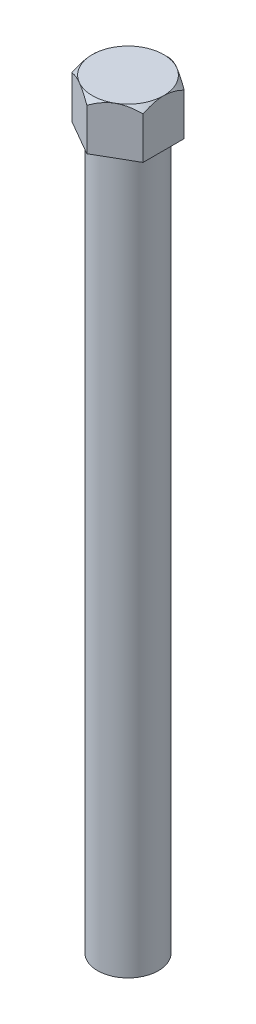
ISO-10303-21;
HEADER;
FILE_DESCRIPTION(('STEP AP214'),'2;1');
FILE_NAME('part.step','',(''),(''),'','','');
FILE_SCHEMA(('AUTOMOTIVE_DESIGN { 1 0 10303 214 1 1 1 1 }'));
ENDSEC;
DATA;
#1=APPLICATION_CONTEXT('core data for automotive mechanical design processes');
#2=APPLICATION_PROTOCOL_DEFINITION('international standard','automotive_design',2000,#1);
#3=PRODUCT_CONTEXT('',#1,'mechanical');
#4=PRODUCT('Part','Part','',(#3));
#5=PRODUCT_RELATED_PRODUCT_CATEGORY('part','',(#4));
#6=PRODUCT_DEFINITION_FORMATION('','',#4);
#7=PRODUCT_DEFINITION_CONTEXT('part definition',#1,'design');
#8=PRODUCT_DEFINITION('design','',#6,#7);
#9=PRODUCT_DEFINITION_SHAPE('','',#8);
#10=(LENGTH_UNIT() NAMED_UNIT(*) SI_UNIT(.MILLI.,.METRE.));
#11=(NAMED_UNIT(*) PLANE_ANGLE_UNIT() SI_UNIT($,.RADIAN.));
#12=(NAMED_UNIT(*) SI_UNIT($,.STERADIAN.) SOLID_ANGLE_UNIT());
#13=UNCERTAINTY_MEASURE_WITH_UNIT(LENGTH_MEASURE(1.E-05),#10,'distance_accuracy_value','');
#14=(GEOMETRIC_REPRESENTATION_CONTEXT(3) GLOBAL_UNCERTAINTY_ASSIGNED_CONTEXT((#13)) GLOBAL_UNIT_ASSIGNED_CONTEXT((#10,
#11,#12)) REPRESENTATION_CONTEXT('',''));
#15=CARTESIAN_POINT('',(0.,0.,0.));
#16=DIRECTION('',(0.,0.,1.));
#17=DIRECTION('',(1.,0.,0.));
#18=AXIS2_PLACEMENT_3D('',#15,#16,#17);
#19=CARTESIAN_POINT('',(0.15,0.2,0.0866025403784438));
#20=DIRECTION('',(-1.,0.,0.));
#21=DIRECTION('',(0.,0.,1.));
#22=AXIS2_PLACEMENT_3D('',#19,#20,#21);
#23=PLANE('',#22);
#24=CARTESIAN_POINT('',(0.15,0.0475902294985284,0.262586498690913));
#25=CARTESIAN_POINT('',(0.15,0.0543267282291559,0.254826375964097));
#26=CARTESIAN_POINT('',(0.15,0.0610238543481202,0.247031178307719));
#27=CARTESIAN_POINT('',(0.15,0.0743131220412113,0.231345588074376));
#28=CARTESIAN_POINT('',(0.15,0.0809052125666027,0.223455152298885));
#29=CARTESIAN_POINT('',(0.15,0.100768108493642,0.199257368061424));
#30=CARTESIAN_POINT('',(0.15,0.11381994836992,0.182770324489989));
#31=CARTESIAN_POINT('',(0.15,0.13891072504273,0.148967316027861));
#32=CARTESIAN_POINT('',(0.15,0.150948238113777,0.13165023782954));
#33=CARTESIAN_POINT('',(0.15,0.167227978592448,0.104665718305432));
#34=CARTESIAN_POINT('',(0.15,0.172343792373168,0.0955360588615133));
#35=CARTESIAN_POINT('',(0.15,0.181664431110572,0.0768307253928077));
#36=CARTESIAN_POINT('',(0.15,0.185870920669696,0.0672559060106033));
#37=CARTESIAN_POINT('',(0.15,0.192978036944956,0.0473652391411249));
#38=CARTESIAN_POINT('',(0.15,0.195847761671669,0.0370376939426317));
#39=CARTESIAN_POINT('',(0.15,0.199489177750611,0.016062265711483));
#40=CARTESIAN_POINT('',(0.15,0.200275178683666,0.00541707791099994));
#41=CARTESIAN_POINT('',(0.15,0.199545010815921,-0.015805559072031));
#42=CARTESIAN_POINT('',(0.15,0.198024815260256,-0.0263828573137506));
#43=CARTESIAN_POINT('',(0.15,0.193097371978144,-0.0471394448417892));
#44=CARTESIAN_POINT('',(0.15,0.189675480583831,-0.0573149809526654));
#45=CARTESIAN_POINT('',(0.15,0.180692373013377,-0.0792923162711168));
#46=CARTESIAN_POINT('',(0.15,0.174827193237606,-0.0909641323370518));
#47=CARTESIAN_POINT('',(0.15,0.162007185387538,-0.113704536639999));
#48=CARTESIAN_POINT('',(0.15,0.155049617254444,-0.124771511003992));
#49=CARTESIAN_POINT('',(0.15,0.133165926569079,-0.157430248891432));
#50=CARTESIAN_POINT('',(0.15,0.117284564930081,-0.178371211639012));
#51=CARTESIAN_POINT('',(0.15,0.0922013732823992,-0.209758792369407));
#52=CARTESIAN_POINT('',(0.15,0.0833643286592083,-0.220516380024448));
#53=CARTESIAN_POINT('',(0.15,0.0655713989105796,-0.241730110309001));
#54=CARTESIAN_POINT('',(0.15,0.0566179307426882,-0.252188275318011));
#55=CARTESIAN_POINT('',(0.15,0.0475902294985459,-0.262586498690927));
#56=B_SPLINE_CURVE_WITH_KNOTS('',3,(#24,#25,#26,#27,#28,#29,#30,#31,#32,#33,#34,#35,#36,#37,#38,
#39,#40,#41,#42,#43,#44,#45,#46,#47,#48,#49,#50,#51,#52,#53,#54,#55),.UNSPECIFIED.,.F.,.F.,(4,2,
2,2,2,2,2,2,2,2,2,2,2,2,2,4),(0.,0.0308295106196295,0.0616735738810823,0.124747488513428,
0.187908509085988,0.219272585467537,0.250578751447974,0.282576530373673,0.314353994406209,
0.346187007659217,0.378268611399949,0.417354566871308,0.456540176553576,0.535274804547161,
0.57704263562936,0.61834564938272),.UNSPECIFIED.);
#57=CARTESIAN_POINT('',(0.149999999999989,0.176794919243123,0.0866025403784503));
#58=VERTEX_POINT('',#57);
#59=CARTESIAN_POINT('',(0.15,0.2,0.));
#60=VERTEX_POINT('',#59);
#61=EDGE_CURVE('E114',#58,#60,#56,.T.);
#62=ORIENTED_EDGE('',*,*,#61,.F.);
#63=DIRECTION('',(0.,-1.,0.));
#64=VECTOR('',#63,1.);
#65=CARTESIAN_POINT('',(0.15,0.2,0.0866025403784438));
#66=LINE('',#65,#64);
#67=CARTESIAN_POINT('',(0.15,0.,0.0866025403784438));
#68=VERTEX_POINT('',#67);
#69=EDGE_CURVE('E63',#58,#68,#66,.T.);
#70=ORIENTED_EDGE('',*,*,#69,.T.);
#71=DIRECTION('',(0.,0.,-1.));
#72=VECTOR('',#71,1.);
#73=CARTESIAN_POINT('',(0.15,0.,0.0866025403784438));
#74=LINE('',#73,#72);
#75=CARTESIAN_POINT('',(0.15,0.,-0.0866025403784439));
#76=VERTEX_POINT('',#75);
#77=EDGE_CURVE('E237',#68,#76,#74,.T.);
#78=ORIENTED_EDGE('',*,*,#77,.T.);
#79=DIRECTION('',(0.,-1.,0.));
#80=VECTOR('',#79,1.);
#81=CARTESIAN_POINT('',(0.15,0.2,-0.0866025403784439));
#82=LINE('',#81,#80);
#83=CARTESIAN_POINT('',(0.149999999999989,0.176794919243123,-0.0866025403784504));
#84=VERTEX_POINT('',#83);
#85=EDGE_CURVE('E134',#84,#76,#82,.T.);
#86=ORIENTED_EDGE('',*,*,#85,.F.);
#87=EDGE_CURVE('E122',#60,#84,#56,.T.);
#88=ORIENTED_EDGE('',*,*,#87,.F.);
#89=EDGE_LOOP('',(#62,#70,#78,#86,#88));
#90=FACE_BOUND('',#89,.T.);
#91=ADVANCED_FACE('F40',(#90),#23,.F.);
#92=CARTESIAN_POINT('',(0.15,0.2,-0.0866025403784439));
#93=DIRECTION('',(-0.499999999999999,0.,0.866025403784439));
#94=DIRECTION('',(0.866025403784439,0.,0.5));
#95=AXIS2_PLACEMENT_3D('',#92,#93,#94);
#96=PLANE('',#95);
#97=CARTESIAN_POINT('',(0.1502,0.176679333796188,-0.086487070324606));
#98=CARTESIAN_POINT('',(0.145025219073231,0.179664213238513,-0.0894747314856735));
#99=CARTESIAN_POINT('',(0.139774588038488,0.182476766429922,-0.0925061847269979));
#100=CARTESIAN_POINT('',(0.129067226667655,0.187627561192785,-0.0986880826967589));
#101=CARTESIAN_POINT('',(0.123609467511676,0.189962921862806,-0.101839121414635));
#102=CARTESIAN_POINT('',(0.107145801716877,0.195929217966136,-0.11134442329311));
#103=CARTESIAN_POINT('',(0.0958544415040203,0.198644596260582,-0.11786349315152));
#104=CARTESIAN_POINT('',(0.0763180955426587,0.200287457293129,-0.129142807751294));
#105=CARTESIAN_POINT('',(0.0681268918469172,0.200077123458692,-0.133872001410018));
#106=CARTESIAN_POINT('',(0.0519118635019776,0.19793463068477,-0.143233752389886));
#107=CARTESIAN_POINT('',(0.0438883087297734,0.195999886089794,-0.147866153897476));
#108=CARTESIAN_POINT('',(0.0297680454683194,0.191320688529291,-0.156018491692504));
#109=CARTESIAN_POINT('',(0.0236074535372857,0.188816236813761,-0.159575311102254));
#110=CARTESIAN_POINT('',(0.0115286846033072,0.18317217065888,-0.166548991597766));
#111=CARTESIAN_POINT('',(0.00560979406743726,0.180034617240185,-0.169966264641954));
#112=CARTESIAN_POINT('',(-0.000200000000328769,0.176679333797509,-0.173320550810915));
#113=B_SPLINE_CURVE_WITH_KNOTS('',3,(#97,#98,#99,#100,#101,#102,#103,#104,#105,#106,#107,#108,
#109,#110,#111,#112),.UNSPECIFIED.,.F.,.F.,(4,2,2,2,2,2,2,4),(0.,0.0200322815723706,
0.0401821439649004,0.0797202979159777,0.107933680780694,0.136189439305524,0.158782101417156,
0.181302367981685),.UNSPECIFIED.);
#114=CARTESIAN_POINT('',(0.0749999999999999,0.2,-0.129903810567666));
#115=VERTEX_POINT('',#114);
#116=EDGE_CURVE('E127',#84,#115,#113,.T.);
#117=ORIENTED_EDGE('',*,*,#116,.F.);
#118=ORIENTED_EDGE('',*,*,#85,.T.);
#119=DIRECTION('',(-0.866025403784439,0.,-0.5));
#120=VECTOR('',#119,1.);
#121=CARTESIAN_POINT('',(0.15,0.,-0.0866025403784439));
#122=LINE('',#121,#120);
#123=CARTESIAN_POINT('',(0.,0.,-0.173205080756888));
#124=VERTEX_POINT('',#123);
#125=EDGE_CURVE('E239',#76,#124,#122,.T.);
#126=ORIENTED_EDGE('',*,*,#125,.T.);
#127=DIRECTION('',(0.,-1.,0.));
#128=VECTOR('',#127,1.);
#129=CARTESIAN_POINT('',(0.,0.2,-0.173205080756888));
#130=LINE('',#129,#128);
#131=CARTESIAN_POINT('',(0.,0.176794919243123,-0.173205080756881));
#132=VERTEX_POINT('',#131);
#133=EDGE_CURVE('E204',#132,#124,#130,.T.);
#134=ORIENTED_EDGE('',*,*,#133,.F.);
#135=EDGE_CURVE('E135',#115,#132,#113,.T.);
#136=ORIENTED_EDGE('',*,*,#135,.F.);
#137=EDGE_LOOP('',(#117,#118,#126,#134,#136));
#138=FACE_BOUND('',#137,.T.);
#139=ADVANCED_FACE('F192',(#138),#96,.F.);
#140=CARTESIAN_POINT('',(0.,0.2,-0.173205080756888));
#141=DIRECTION('',(0.5,0.,0.866025403784439));
#142=DIRECTION('',(0.866025403784439,0.,-0.5));
#143=AXIS2_PLACEMENT_3D('',#140,#141,#142);
#144=PLANE('',#143);
#145=CARTESIAN_POINT('',(0.000199999999999994,0.176679333796188,-0.173320550810726));
#146=CARTESIAN_POINT('',(-0.0049747809267692,0.179664213238513,-0.170332889649658));
#147=CARTESIAN_POINT('',(-0.0102254119615123,0.182476766429922,-0.167301436408334));
#148=CARTESIAN_POINT('',(-0.0209327733323452,0.187627561192785,-0.161119538438573));
#149=CARTESIAN_POINT('',(-0.0263905324883241,0.189962921862806,-0.157968499720696));
#150=CARTESIAN_POINT('',(-0.0428541982831226,0.195929217966136,-0.148463197842221));
#151=CARTESIAN_POINT('',(-0.0541455584959796,0.198644596260582,-0.141944127983811));
#152=CARTESIAN_POINT('',(-0.0736819044573412,0.200287457293129,-0.130664813384037));
#153=CARTESIAN_POINT('',(-0.0818731081530827,0.200077123458692,-0.125935619725314));
#154=CARTESIAN_POINT('',(-0.0980881364980222,0.19793463068477,-0.116573868745446));
#155=CARTESIAN_POINT('',(-0.106111691270226,0.195999886089794,-0.111941467237856));
#156=CARTESIAN_POINT('',(-0.12023195453168,0.191320688529291,-0.103789129442827));
#157=CARTESIAN_POINT('',(-0.126392546462714,0.188816236813762,-0.100232310033077));
#158=CARTESIAN_POINT('',(-0.138471315396693,0.18317217065888,-0.0932586295375655));
#159=CARTESIAN_POINT('',(-0.144390205932563,0.180034617240185,-0.0898413564933771));
#160=CARTESIAN_POINT('',(-0.150200000000329,0.176679333797509,-0.0864870703244161));
#161=B_SPLINE_CURVE_WITH_KNOTS('',3,(#145,#146,#147,#148,#149,#150,#151,#152,#153,#154,#155,
#156,#157,#158,#159,#160),.UNSPECIFIED.,.F.,.F.,(4,2,2,2,2,2,2,4),(0.,0.0200322815723706,
0.0401821439649003,0.0797202979159775,0.107933680780694,0.136189439305524,0.158782101417156,
0.181302367981685),.UNSPECIFIED.);
#162=CARTESIAN_POINT('',(-0.075,0.2,-0.129903810567666));
#163=VERTEX_POINT('',#162);
#164=EDGE_CURVE('E186',#132,#163,#161,.T.);
#165=ORIENTED_EDGE('',*,*,#164,.F.);
#166=ORIENTED_EDGE('',*,*,#133,.T.);
#167=DIRECTION('',(-0.866025403784439,0.,0.5));
#168=VECTOR('',#167,1.);
#169=CARTESIAN_POINT('',(0.,0.,-0.173205080756888));
#170=LINE('',#169,#168);
#171=CARTESIAN_POINT('',(-0.15,0.,-0.0866025403784438));
#172=VERTEX_POINT('',#171);
#173=EDGE_CURVE('E222',#124,#172,#170,.T.);
#174=ORIENTED_EDGE('',*,*,#173,.T.);
#175=DIRECTION('',(0.,-1.,0.));
#176=VECTOR('',#175,1.);
#177=CARTESIAN_POINT('',(-0.15,0.2,-0.0866025403784438));
#178=LINE('',#177,#176);
#179=CARTESIAN_POINT('',(-0.15,0.176794919243112,-0.0866025403784438));
#180=VERTEX_POINT('',#179);
#181=EDGE_CURVE('E220',#180,#172,#178,.T.);
#182=ORIENTED_EDGE('',*,*,#181,.F.);
#183=EDGE_CURVE('E180',#163,#180,#161,.T.);
#184=ORIENTED_EDGE('',*,*,#183,.F.);
#185=EDGE_LOOP('',(#165,#166,#174,#182,#184));
#186=FACE_BOUND('',#185,.T.);
#187=ADVANCED_FACE('F188',(#186),#144,.F.);
#188=CARTESIAN_POINT('',(-0.15,0.2,-0.0866025403784438));
#189=DIRECTION('',(1.,0.,0.));
#190=DIRECTION('',(0.,0.,-1.));
#191=AXIS2_PLACEMENT_3D('',#188,#189,#190);
#192=PLANE('',#191);
#193=CARTESIAN_POINT('',(-0.15,0.0475902294985284,-0.262586498690913));
#194=CARTESIAN_POINT('',(-0.15,0.0543267282291559,-0.254826375964097));
#195=CARTESIAN_POINT('',(-0.15,0.0610238543481202,-0.247031178307719));
#196=CARTESIAN_POINT('',(-0.15,0.0743131220412113,-0.231345588074377));
#197=CARTESIAN_POINT('',(-0.15,0.0809052125666027,-0.223455152298885));
#198=CARTESIAN_POINT('',(-0.15,0.100768108493642,-0.199257368061424));
#199=CARTESIAN_POINT('',(-0.15,0.11381994836992,-0.182770324489989));
#200=CARTESIAN_POINT('',(-0.15,0.13891072504273,-0.148967316027861));
#201=CARTESIAN_POINT('',(-0.15,0.150948238113777,-0.13165023782954));
#202=CARTESIAN_POINT('',(-0.15,0.167227978592448,-0.104665718305432));
#203=CARTESIAN_POINT('',(-0.15,0.172343792373168,-0.0955360588615133));
#204=CARTESIAN_POINT('',(-0.15,0.181664431110572,-0.0768307253928077));
#205=CARTESIAN_POINT('',(-0.15,0.185870920669696,-0.0672559060106033));
#206=CARTESIAN_POINT('',(-0.15,0.192978036944956,-0.047365239141125));
#207=CARTESIAN_POINT('',(-0.15,0.195847761671669,-0.0370376939426317));
#208=CARTESIAN_POINT('',(-0.15,0.199489177750611,-0.016062265711483));
#209=CARTESIAN_POINT('',(-0.15,0.200275178683666,-0.00541707791099998));
#210=CARTESIAN_POINT('',(-0.15,0.199545010815921,0.0158055590720309));
#211=CARTESIAN_POINT('',(-0.15,0.198024815260256,0.0263828573137505));
#212=CARTESIAN_POINT('',(-0.15,0.193097371978145,0.0471394448417891));
#213=CARTESIAN_POINT('',(-0.15,0.189675480583831,0.0573149809526653));
#214=CARTESIAN_POINT('',(-0.15,0.180692373013378,0.0792923162711167));
#215=CARTESIAN_POINT('',(-0.15,0.174827193237607,0.0909641323370517));
#216=CARTESIAN_POINT('',(-0.15,0.162007185387538,0.113704536639999));
#217=CARTESIAN_POINT('',(-0.15,0.155049617254444,0.124771511003992));
#218=CARTESIAN_POINT('',(-0.15,0.133165926569079,0.157430248891432));
#219=CARTESIAN_POINT('',(-0.15,0.117284564930082,0.178371211639012));
#220=CARTESIAN_POINT('',(-0.15,0.0922013732823995,0.209758792369407));
#221=CARTESIAN_POINT('',(-0.15,0.0833643286592085,0.220516380024448));
#222=CARTESIAN_POINT('',(-0.15,0.0655713989105797,0.241730110309001));
#223=CARTESIAN_POINT('',(-0.15,0.0566179307426884,0.252188275318011));
#224=CARTESIAN_POINT('',(-0.15,0.047590229498546,0.262586498690927));
#225=B_SPLINE_CURVE_WITH_KNOTS('',3,(#193,#194,#195,#196,#197,#198,#199,#200,#201,#202,#203,
#204,#205,#206,#207,#208,#209,#210,#211,#212,#213,#214,#215,#216,#217,#218,#219,#220,#221,#222,
#223,#224),.UNSPECIFIED.,.F.,.F.,(4,2,2,2,2,2,2,2,2,2,2,2,2,2,2,4),(0.,0.0308295106196294,
0.0616735738810823,0.124747488513428,0.187908509085988,0.219272585467537,0.250578751447974,
0.282576530373673,0.314353994406209,0.346187007659217,0.378268611399949,0.417354566871308,
0.456540176553576,0.535274804547161,0.57704263562936,0.618345649382719),.UNSPECIFIED.);
#226=CARTESIAN_POINT('',(-0.15,0.2,0.));
#227=VERTEX_POINT('',#226);
#228=EDGE_CURVE('E187',#180,#227,#225,.T.);
#229=ORIENTED_EDGE('',*,*,#228,.F.);
#230=ORIENTED_EDGE('',*,*,#181,.T.);
#231=DIRECTION('',(0.,0.,1.));
#232=VECTOR('',#231,1.);
#233=CARTESIAN_POINT('',(-0.15,0.,-0.0866025403784438));
#234=LINE('',#233,#232);
#235=CARTESIAN_POINT('',(-0.15,0.,0.0866025403784439));
#236=VERTEX_POINT('',#235);
#237=EDGE_CURVE('E242',#172,#236,#234,.T.);
#238=ORIENTED_EDGE('',*,*,#237,.T.);
#239=DIRECTION('',(0.,-1.,0.));
#240=VECTOR('',#239,1.);
#241=CARTESIAN_POINT('',(-0.15,0.2,0.0866025403784439));
#242=LINE('',#241,#240);
#243=CARTESIAN_POINT('',(-0.149999999999989,0.176794919243123,0.0866025403784503));
#244=VERTEX_POINT('',#243);
#245=EDGE_CURVE('E226',#244,#236,#242,.T.);
#246=ORIENTED_EDGE('',*,*,#245,.F.);
#247=EDGE_CURVE('E174',#227,#244,#225,.T.);
#248=ORIENTED_EDGE('',*,*,#247,.F.);
#249=EDGE_LOOP('',(#229,#230,#238,#246,#248));
#250=FACE_BOUND('',#249,.T.);
#251=ADVANCED_FACE('F191',(#250),#192,.F.);
#252=CARTESIAN_POINT('',(-0.15,0.2,0.0866025403784439));
#253=DIRECTION('',(0.5,0.,-0.866025403784439));
#254=DIRECTION('',(-0.866025403784439,0.,-0.5));
#255=AXIS2_PLACEMENT_3D('',#252,#253,#254);
#256=PLANE('',#255);
#257=CARTESIAN_POINT('',(-0.1502,0.176679333796188,0.086487070324606));
#258=CARTESIAN_POINT('',(-0.145025219073231,0.179664213238513,0.0894747314856735));
#259=CARTESIAN_POINT('',(-0.139774588038488,0.182476766429922,0.0925061847269978));
#260=CARTESIAN_POINT('',(-0.129067226667655,0.187627561192785,0.0986880826967588));
#261=CARTESIAN_POINT('',(-0.123609467511676,0.189962921862806,0.101839121414635));
#262=CARTESIAN_POINT('',(-0.107145801716877,0.195929217966136,0.11134442329311));
#263=CARTESIAN_POINT('',(-0.0958544415040203,0.198644596260582,0.11786349315152));
#264=CARTESIAN_POINT('',(-0.0763180955426587,0.200287457293129,0.129142807751294));
#265=CARTESIAN_POINT('',(-0.0681268918469172,0.200077123458692,0.133872001410018));
#266=CARTESIAN_POINT('',(-0.0519118635019777,0.19793463068477,0.143233752389886));
#267=CARTESIAN_POINT('',(-0.0438883087297735,0.195999886089794,0.147866153897476));
#268=CARTESIAN_POINT('',(-0.0297680454683194,0.191320688529291,0.156018491692504));
#269=CARTESIAN_POINT('',(-0.0236074535372857,0.188816236813761,0.159575311102254));
#270=CARTESIAN_POINT('',(-0.0115286846033071,0.18317217065888,0.166548991597766));
#271=CARTESIAN_POINT('',(-0.0056097940674372,0.180034617240185,0.169966264641954));
#272=CARTESIAN_POINT('',(0.000200000000328857,0.176679333797509,0.173320550810915));
#273=B_SPLINE_CURVE_WITH_KNOTS('',3,(#257,#258,#259,#260,#261,#262,#263,#264,#265,#266,#267,
#268,#269,#270,#271,#272),.UNSPECIFIED.,.F.,.F.,(4,2,2,2,2,2,2,4),(0.,0.0200322815723706,
0.0401821439649004,0.0797202979159776,0.107933680780694,0.136189439305524,0.158782101417156,
0.181302367981685),.UNSPECIFIED.);
#274=CARTESIAN_POINT('',(-0.075,0.2,0.129903810567666));
#275=VERTEX_POINT('',#274);
#276=EDGE_CURVE('E265',#244,#275,#273,.T.);
#277=ORIENTED_EDGE('',*,*,#276,.F.);
#278=ORIENTED_EDGE('',*,*,#245,.T.);
#279=DIRECTION('',(0.866025403784439,0.,0.5));
#280=VECTOR('',#279,1.);
#281=CARTESIAN_POINT('',(-0.15,0.,0.0866025403784439));
#282=LINE('',#281,#280);
#283=CARTESIAN_POINT('',(0.,0.,0.173205080756888));
#284=VERTEX_POINT('',#283);
#285=EDGE_CURVE('E244',#236,#284,#282,.T.);
#286=ORIENTED_EDGE('',*,*,#285,.T.);
#287=DIRECTION('',(0.,-1.,0.));
#288=VECTOR('',#287,1.);
#289=CARTESIAN_POINT('',(0.,0.2,0.173205080756888));
#290=LINE('',#289,#288);
#291=CARTESIAN_POINT('',(0.,0.176794919243123,0.173205080756881));
#292=VERTEX_POINT('',#291);
#293=EDGE_CURVE('E229',#292,#284,#290,.T.);
#294=ORIENTED_EDGE('',*,*,#293,.F.);
#295=EDGE_CURVE('E166',#275,#292,#273,.T.);
#296=ORIENTED_EDGE('',*,*,#295,.F.);
#297=EDGE_LOOP('',(#277,#278,#286,#294,#296));
#298=FACE_BOUND('',#297,.T.);
#299=ADVANCED_FACE('F260',(#298),#256,.F.);
#300=CARTESIAN_POINT('',(0.,0.2,0.173205080756888));
#301=DIRECTION('',(-0.5,0.,-0.866025403784438));
#302=DIRECTION('',(-0.866025403784438,0.,0.5));
#303=AXIS2_PLACEMENT_3D('',#300,#301,#302);
#304=PLANE('',#303);
#305=CARTESIAN_POINT('',(-0.000199999999999919,0.176679333796188,0.173320550810726));
#306=CARTESIAN_POINT('',(0.00497478092676928,0.179664213238513,0.170332889649658));
#307=CARTESIAN_POINT('',(0.0102254119615124,0.182476766429922,0.167301436408334));
#308=CARTESIAN_POINT('',(0.0209327733323453,0.187627561192785,0.161119538438573));
#309=CARTESIAN_POINT('',(0.0263905324883242,0.189962921862806,0.157968499720696));
#310=CARTESIAN_POINT('',(0.0428541982831227,0.195929217966136,0.148463197842221));
#311=CARTESIAN_POINT('',(0.0541455584959797,0.198644596260582,0.141944127983811));
#312=CARTESIAN_POINT('',(0.0736819044573413,0.200287457293129,0.130664813384037));
#313=CARTESIAN_POINT('',(0.0818731081530828,0.200077123458692,0.125935619725314));
#314=CARTESIAN_POINT('',(0.0980881364980223,0.19793463068477,0.116573868745446));
#315=CARTESIAN_POINT('',(0.106111691270226,0.195999886089794,0.111941467237856));
#316=CARTESIAN_POINT('',(0.120231954531681,0.191320688529291,0.103789129442827));
#317=CARTESIAN_POINT('',(0.126392546462714,0.188816236813761,0.100232310033077));
#318=CARTESIAN_POINT('',(0.138471315396693,0.18317217065888,0.0932586295375655));
#319=CARTESIAN_POINT('',(0.144390205932563,0.180034617240185,0.0898413564933771));
#320=CARTESIAN_POINT('',(0.150200000000329,0.176679333797509,0.0864870703244161));
#321=B_SPLINE_CURVE_WITH_KNOTS('',3,(#305,#306,#307,#308,#309,#310,#311,#312,#313,#314,#315,
#316,#317,#318,#319,#320),.UNSPECIFIED.,.F.,.F.,(4,2,2,2,2,2,2,4),(0.,0.0200322815723705,
0.0401821439649003,0.0797202979159776,0.107933680780694,0.136189439305524,0.158782101417156,
0.181302367981685),.UNSPECIFIED.);
#322=CARTESIAN_POINT('',(0.0750000000000001,0.2,0.129903810567666));
#323=VERTEX_POINT('',#322);
#324=EDGE_CURVE('E255',#292,#323,#321,.T.);
#325=ORIENTED_EDGE('',*,*,#324,.F.);
#326=ORIENTED_EDGE('',*,*,#293,.T.);
#327=DIRECTION('',(0.866025403784438,0.,-0.5));
#328=VECTOR('',#327,1.);
#329=CARTESIAN_POINT('',(0.,0.,0.173205080756888));
#330=LINE('',#329,#328);
#331=EDGE_CURVE('E247',#284,#68,#330,.T.);
#332=ORIENTED_EDGE('',*,*,#331,.T.);
#333=ORIENTED_EDGE('',*,*,#69,.F.);
#334=EDGE_CURVE('E119',#323,#58,#321,.T.);
#335=ORIENTED_EDGE('',*,*,#334,.F.);
#336=EDGE_LOOP('',(#325,#326,#332,#333,#335));
#337=FACE_BOUND('',#336,.T.);
#338=ADVANCED_FACE('F252',(#337),#304,.F.);
#339=CARTESIAN_POINT('',(0.,0.,0.));
#340=DIRECTION('',(0.,1.,0.));
#341=DIRECTION('',(0.,0.,1.));
#342=AXIS2_PLACEMENT_3D('',#339,#340,#341);
#343=PLANE('',#342);
#344=CARTESIAN_POINT('',(0.,0.,0.));
#345=DIRECTION('',(0.,-1.,0.));
#346=DIRECTION('',(0.,0.,-1.));
#347=AXIS2_PLACEMENT_3D('',#344,#345,#346);
#348=CIRCLE('',#347,0.128248652524469);
#349=CARTESIAN_POINT('',(0.,0.,-0.128248652524469));
#350=VERTEX_POINT('',#349);
#351=EDGE_CURVE('E232',#350,#350,#348,.T.);
#352=ORIENTED_EDGE('',*,*,#351,.F.);
#353=EDGE_LOOP('',(#352));
#354=FACE_BOUND('',#353,.T.);
#355=ORIENTED_EDGE('',*,*,#77,.F.);
#356=ORIENTED_EDGE('',*,*,#331,.F.);
#357=ORIENTED_EDGE('',*,*,#285,.F.);
#358=ORIENTED_EDGE('',*,*,#237,.F.);
#359=ORIENTED_EDGE('',*,*,#173,.F.);
#360=ORIENTED_EDGE('',*,*,#125,.F.);
#361=EDGE_LOOP('',(#355,#356,#357,#358,#359,#360));
#362=FACE_BOUND('',#361,.T.);
#363=ADVANCED_FACE('F263',(#354,#362),#343,.F.);
#364=CARTESIAN_POINT('',(0.,-3.,0.));
#365=DIRECTION('',(0.,1.,0.));
#366=DIRECTION('',(0.,0.,1.));
#367=AXIS2_PLACEMENT_3D('',#364,#365,#366);
#368=CYLINDRICAL_SURFACE('',#367,0.128248652524469);
#369=CARTESIAN_POINT('',(0.,-3.,0.));
#370=DIRECTION('',(0.,-1.,0.));
#371=DIRECTION('',(0.,0.,-1.));
#372=AXIS2_PLACEMENT_3D('',#369,#370,#371);
#373=CIRCLE('',#372,0.128248652524469);
#374=CARTESIAN_POINT('',(0.,-3.,-0.128248652524469));
#375=VERTEX_POINT('',#374);
#376=EDGE_CURVE('E121',#375,#375,#373,.T.);
#377=ORIENTED_EDGE('',*,*,#376,.F.);
#378=EDGE_LOOP('',(#377));
#379=FACE_BOUND('',#378,.T.);
#380=ORIENTED_EDGE('',*,*,#351,.T.);
#381=EDGE_LOOP('',(#380));
#382=FACE_BOUND('',#381,.T.);
#383=ADVANCED_FACE('F276',(#379,#382),#368,.T.);
#384=CARTESIAN_POINT('',(0.,-3.,0.));
#385=DIRECTION('',(0.,-1.,0.));
#386=DIRECTION('',(0.,0.,-1.));
#387=AXIS2_PLACEMENT_3D('',#384,#385,#386);
#388=PLANE('',#387);
#389=ORIENTED_EDGE('',*,*,#376,.T.);
#390=EDGE_LOOP('',(#389));
#391=FACE_BOUND('',#390,.T.);
#392=ADVANCED_FACE('F153',(#391),#388,.T.);
#393=CARTESIAN_POINT('',(0.,0.2,0.));
#394=DIRECTION('',(0.,-1.,0.));
#395=DIRECTION('',(0.,0.,1.));
#396=AXIS2_PLACEMENT_3D('',#393,#394,#395);
#397=CONICAL_SURFACE('',#396,0.15,0.78539816339745);
#398=ORIENTED_EDGE('',*,*,#295,.T.);
#399=ORIENTED_EDGE('',*,*,#324,.T.);
#400=CARTESIAN_POINT('',(0.,0.2,0.));
#401=DIRECTION('',(0.,1.,0.));
#402=DIRECTION('',(0.,0.,1.));
#403=AXIS2_PLACEMENT_3D('',#400,#401,#402);
#404=CIRCLE('',#403,0.15);
#405=EDGE_CURVE('E44',#275,#323,#404,.T.);
#406=ORIENTED_EDGE('',*,*,#405,.F.);
#407=EDGE_LOOP('',(#398,#399,#406));
#408=FACE_BOUND('',#407,.T.);
#409=ADVANCED_FACE('F152',(#408),#397,.T.);
#410=ORIENTED_EDGE('',*,*,#247,.T.);
#411=ORIENTED_EDGE('',*,*,#276,.T.);
#412=EDGE_CURVE('E217',#227,#275,#404,.T.);
#413=ORIENTED_EDGE('',*,*,#412,.F.);
#414=EDGE_LOOP('',(#410,#411,#413));
#415=FACE_BOUND('',#414,.T.);
#416=ADVANCED_FACE('F267',(#415),#397,.T.);
#417=ORIENTED_EDGE('',*,*,#183,.T.);
#418=ORIENTED_EDGE('',*,*,#228,.T.);
#419=EDGE_CURVE('E212',#163,#227,#404,.T.);
#420=ORIENTED_EDGE('',*,*,#419,.F.);
#421=EDGE_LOOP('',(#417,#418,#420));
#422=FACE_BOUND('',#421,.T.);
#423=ADVANCED_FACE('F213',(#422),#397,.T.);
#424=ORIENTED_EDGE('',*,*,#135,.T.);
#425=ORIENTED_EDGE('',*,*,#164,.T.);
#426=EDGE_CURVE('E49',#115,#163,#404,.T.);
#427=ORIENTED_EDGE('',*,*,#426,.F.);
#428=EDGE_LOOP('',(#424,#425,#427));
#429=FACE_BOUND('',#428,.T.);
#430=ADVANCED_FACE('F208',(#429),#397,.T.);
#431=ORIENTED_EDGE('',*,*,#87,.T.);
#432=ORIENTED_EDGE('',*,*,#116,.T.);
#433=EDGE_CURVE('E12',#60,#115,#404,.T.);
#434=ORIENTED_EDGE('',*,*,#433,.F.);
#435=EDGE_LOOP('',(#431,#432,#434));
#436=FACE_BOUND('',#435,.T.);
#437=ADVANCED_FACE('F125',(#436),#397,.T.);
#438=ORIENTED_EDGE('',*,*,#61,.T.);
#439=CARTESIAN_POINT('',(0.,0.2,0.));
#440=DIRECTION('',(0.,1.,0.));
#441=DIRECTION('',(0.,0.,1.));
#442=AXIS2_PLACEMENT_3D('',#439,#440,#441);
#443=CIRCLE('',#442,0.15);
#444=EDGE_CURVE('E117',#323,#60,#443,.T.);
#445=ORIENTED_EDGE('',*,*,#444,.F.);
#446=ORIENTED_EDGE('',*,*,#334,.T.);
#447=EDGE_LOOP('',(#438,#445,#446));
#448=FACE_BOUND('',#447,.T.);
#449=ADVANCED_FACE('F116',(#448),#397,.T.);
#450=CARTESIAN_POINT('',(0.,0.2,0.));
#451=DIRECTION('',(0.,1.,0.));
#452=DIRECTION('',(0.,0.,1.));
#453=AXIS2_PLACEMENT_3D('',#450,#451,#452);
#454=PLANE('',#453);
#455=ORIENTED_EDGE('',*,*,#405,.T.);
#456=ORIENTED_EDGE('',*,*,#444,.T.);
#457=ORIENTED_EDGE('',*,*,#433,.T.);
#458=ORIENTED_EDGE('',*,*,#426,.T.);
#459=ORIENTED_EDGE('',*,*,#419,.T.);
#460=ORIENTED_EDGE('',*,*,#412,.T.);
#461=EDGE_LOOP('',(#455,#456,#457,#458,#459,#460));
#462=FACE_BOUND('',#461,.T.);
#463=ADVANCED_FACE('F131',(#462),#454,.T.);
#464=CLOSED_SHELL('',(#91,#139,#187,#251,#299,#338,#363,#383,#392,#409,#416,#423,#430,#437,#449,#463));
#465=MANIFOLD_SOLID_BREP('B2',#464);
#466=ADVANCED_BREP_SHAPE_REPRESENTATION('',(#18,#465),#14);
#467=SHAPE_DEFINITION_REPRESENTATION(#9,#466);
ENDSEC;
END-ISO-10303-21;
